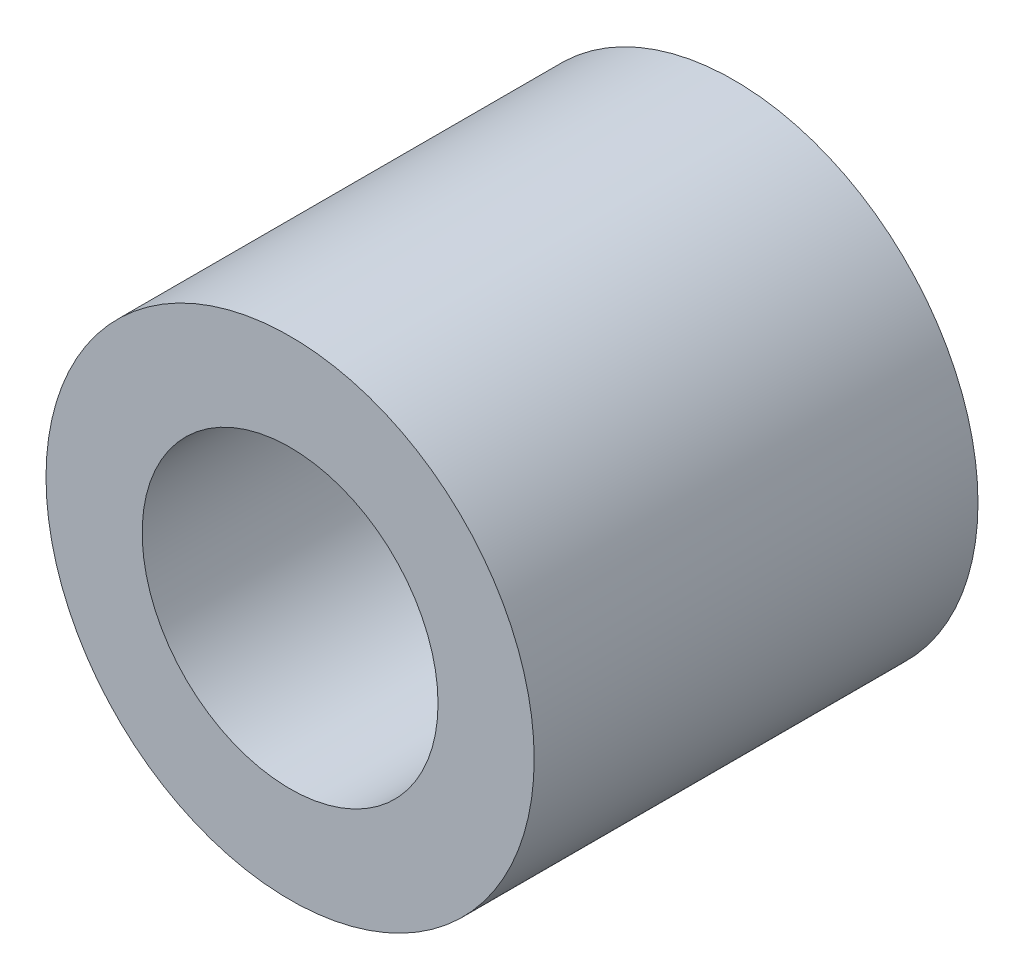
ISO-10303-21;
HEADER;
FILE_DESCRIPTION(('STEP AP214'),'2;1');
FILE_NAME('part.step','',(''),(''),'','','');
FILE_SCHEMA(('AUTOMOTIVE_DESIGN { 1 0 10303 214 1 1 1 1 }'));
ENDSEC;
DATA;
#1=APPLICATION_CONTEXT('core data for automotive mechanical design processes');
#2=APPLICATION_PROTOCOL_DEFINITION('international standard','automotive_design',2000,#1);
#3=PRODUCT_CONTEXT('',#1,'mechanical');
#4=PRODUCT('Part','Part','',(#3));
#5=PRODUCT_RELATED_PRODUCT_CATEGORY('part','',(#4));
#6=PRODUCT_DEFINITION_FORMATION('','',#4);
#7=PRODUCT_DEFINITION_CONTEXT('part definition',#1,'design');
#8=PRODUCT_DEFINITION('design','',#6,#7);
#9=PRODUCT_DEFINITION_SHAPE('','',#8);
#10=(LENGTH_UNIT() NAMED_UNIT(*) SI_UNIT(.MILLI.,.METRE.));
#11=(NAMED_UNIT(*) PLANE_ANGLE_UNIT() SI_UNIT($,.RADIAN.));
#12=(NAMED_UNIT(*) SI_UNIT($,.STERADIAN.) SOLID_ANGLE_UNIT());
#13=UNCERTAINTY_MEASURE_WITH_UNIT(LENGTH_MEASURE(1.E-05),#10,'distance_accuracy_value','');
#14=(GEOMETRIC_REPRESENTATION_CONTEXT(3) GLOBAL_UNCERTAINTY_ASSIGNED_CONTEXT((#13)) GLOBAL_UNIT_ASSIGNED_CONTEXT((#10,
#11,#12)) REPRESENTATION_CONTEXT('',''));
#15=CARTESIAN_POINT('',(0.,0.,0.));
#16=DIRECTION('',(0.,0.,1.));
#17=DIRECTION('',(1.,0.,0.));
#18=AXIS2_PLACEMENT_3D('',#15,#16,#17);
#19=CARTESIAN_POINT('',(0.,0.,15.));
#20=DIRECTION('',(0.,0.,1.));
#21=DIRECTION('',(1.,0.,0.));
#22=AXIS2_PLACEMENT_3D('',#19,#20,#21);
#23=PLANE('',#22);
#24=CARTESIAN_POINT('',(0.,0.,15.));
#25=DIRECTION('',(0.,0.,1.));
#26=DIRECTION('',(1.,0.,0.));
#27=AXIS2_PLACEMENT_3D('',#24,#25,#26);
#28=CIRCLE('',#27,8.25);
#29=CARTESIAN_POINT('',(8.25,0.,15.));
#30=VERTEX_POINT('',#29);
#31=EDGE_CURVE('E10',#30,#30,#28,.T.);
#32=ORIENTED_EDGE('',*,*,#31,.T.);
#33=EDGE_LOOP('',(#32));
#34=FACE_BOUND('',#33,.T.);
#35=CARTESIAN_POINT('',(0.,0.,15.));
#36=DIRECTION('',(0.,0.,1.));
#37=DIRECTION('',(1.,0.,0.));
#38=AXIS2_PLACEMENT_3D('',#35,#36,#37);
#39=CIRCLE('',#38,5.);
#40=CARTESIAN_POINT('',(5.,0.,15.));
#41=VERTEX_POINT('',#40);
#42=EDGE_CURVE('E42',#41,#41,#39,.T.);
#43=ORIENTED_EDGE('',*,*,#42,.F.);
#44=EDGE_LOOP('',(#43));
#45=FACE_BOUND('',#44,.T.);
#46=ADVANCED_FACE('F31',(#34,#45),#23,.T.);
#47=CARTESIAN_POINT('',(0.,0.,0.));
#48=DIRECTION('',(0.,0.,1.));
#49=DIRECTION('',(1.,0.,0.));
#50=AXIS2_PLACEMENT_3D('',#47,#48,#49);
#51=PLANE('',#50);
#52=CARTESIAN_POINT('',(0.,0.,0.));
#53=DIRECTION('',(0.,0.,1.));
#54=DIRECTION('',(1.,0.,0.));
#55=AXIS2_PLACEMENT_3D('',#52,#53,#54);
#56=CIRCLE('',#55,8.25);
#57=CARTESIAN_POINT('',(8.25,0.,0.));
#58=VERTEX_POINT('',#57);
#59=EDGE_CURVE('E35',#58,#58,#56,.T.);
#60=ORIENTED_EDGE('',*,*,#59,.F.);
#61=EDGE_LOOP('',(#60));
#62=FACE_BOUND('',#61,.T.);
#63=CARTESIAN_POINT('',(0.,0.,0.));
#64=DIRECTION('',(0.,0.,1.));
#65=DIRECTION('',(1.,0.,0.));
#66=AXIS2_PLACEMENT_3D('',#63,#64,#65);
#67=CIRCLE('',#66,5.);
#68=CARTESIAN_POINT('',(5.,0.,0.));
#69=VERTEX_POINT('',#68);
#70=EDGE_CURVE('E44',#69,#69,#67,.T.);
#71=ORIENTED_EDGE('',*,*,#70,.T.);
#72=EDGE_LOOP('',(#71));
#73=FACE_BOUND('',#72,.T.);
#74=ADVANCED_FACE('F54',(#62,#73),#51,.F.);
#75=CARTESIAN_POINT('',(0.,0.,15.));
#76=DIRECTION('',(0.,0.,-1.));
#77=DIRECTION('',(-1.,0.,0.));
#78=AXIS2_PLACEMENT_3D('',#75,#76,#77);
#79=CYLINDRICAL_SURFACE('',#78,8.25);
#80=ORIENTED_EDGE('',*,*,#31,.F.);
#81=EDGE_LOOP('',(#80));
#82=FACE_BOUND('',#81,.T.);
#83=ORIENTED_EDGE('',*,*,#59,.T.);
#84=EDGE_LOOP('',(#83));
#85=FACE_BOUND('',#84,.T.);
#86=ADVANCED_FACE('F33',(#82,#85),#79,.T.);
#87=CARTESIAN_POINT('',(0.,0.,15.));
#88=DIRECTION('',(0.,0.,-1.));
#89=DIRECTION('',(-1.,0.,0.));
#90=AXIS2_PLACEMENT_3D('',#87,#88,#89);
#91=CYLINDRICAL_SURFACE('',#90,5.);
#92=ORIENTED_EDGE('',*,*,#42,.T.);
#93=EDGE_LOOP('',(#92));
#94=FACE_BOUND('',#93,.T.);
#95=ORIENTED_EDGE('',*,*,#70,.F.);
#96=EDGE_LOOP('',(#95));
#97=FACE_BOUND('',#96,.T.);
#98=ADVANCED_FACE('F50',(#94,#97),#91,.F.);
#99=CLOSED_SHELL('',(#46,#74,#86,#98));
#100=MANIFOLD_SOLID_BREP('B2',#99);
#101=ADVANCED_BREP_SHAPE_REPRESENTATION('',(#18,#100),#14);
#102=SHAPE_DEFINITION_REPRESENTATION(#9,#101);
ENDSEC;
END-ISO-10303-21;
